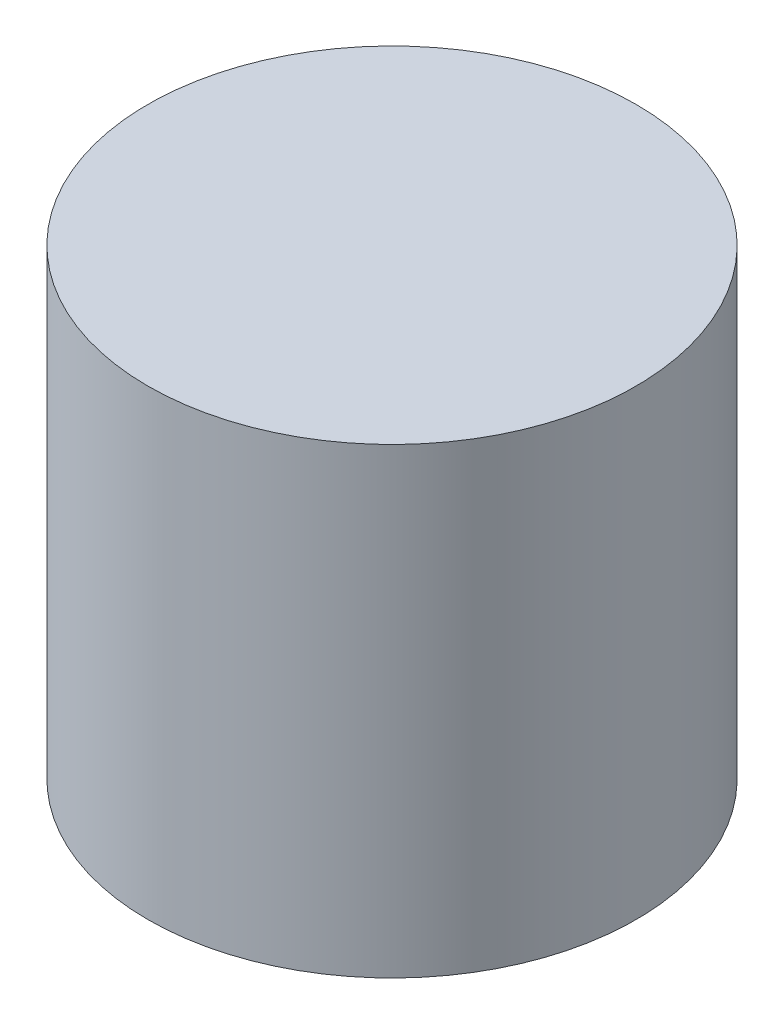
ISO-10303-21;
HEADER;
FILE_DESCRIPTION(('STEP AP214'),'2;1');
FILE_NAME('part.step','',(''),(''),'','','');
FILE_SCHEMA(('AUTOMOTIVE_DESIGN { 1 0 10303 214 1 1 1 1 }'));
ENDSEC;
DATA;
#1=APPLICATION_CONTEXT('core data for automotive mechanical design processes');
#2=APPLICATION_PROTOCOL_DEFINITION('international standard','automotive_design',2000,#1);
#3=PRODUCT_CONTEXT('',#1,'mechanical');
#4=PRODUCT('Part','Part','',(#3));
#5=PRODUCT_RELATED_PRODUCT_CATEGORY('part','',(#4));
#6=PRODUCT_DEFINITION_FORMATION('','',#4);
#7=PRODUCT_DEFINITION_CONTEXT('part definition',#1,'design');
#8=PRODUCT_DEFINITION('design','',#6,#7);
#9=PRODUCT_DEFINITION_SHAPE('','',#8);
#10=(LENGTH_UNIT() NAMED_UNIT(*) SI_UNIT(.MILLI.,.METRE.));
#11=(NAMED_UNIT(*) PLANE_ANGLE_UNIT() SI_UNIT($,.RADIAN.));
#12=(NAMED_UNIT(*) SI_UNIT($,.STERADIAN.) SOLID_ANGLE_UNIT());
#13=UNCERTAINTY_MEASURE_WITH_UNIT(LENGTH_MEASURE(1.E-05),#10,'distance_accuracy_value','');
#14=(GEOMETRIC_REPRESENTATION_CONTEXT(3) GLOBAL_UNCERTAINTY_ASSIGNED_CONTEXT((#13)) GLOBAL_UNIT_ASSIGNED_CONTEXT((#10,
#11,#12)) REPRESENTATION_CONTEXT('',''));
#15=CARTESIAN_POINT('',(0.,0.,0.));
#16=DIRECTION('',(0.,0.,1.));
#17=DIRECTION('',(1.,0.,0.));
#18=AXIS2_PLACEMENT_3D('',#15,#16,#17);
#19=CARTESIAN_POINT('',(0.,71.,0.));
#20=DIRECTION('',(0.,-1.,0.));
#21=DIRECTION('',(0.,0.,-1.));
#22=AXIS2_PLACEMENT_3D('',#19,#20,#21);
#23=CYLINDRICAL_SURFACE('',#22,37.5);
#24=CARTESIAN_POINT('',(0.,71.,0.));
#25=DIRECTION('',(0.,1.,0.));
#26=DIRECTION('',(0.,0.,1.));
#27=AXIS2_PLACEMENT_3D('',#24,#25,#26);
#28=CIRCLE('',#27,37.5);
#29=CARTESIAN_POINT('',(0.,71.,37.5));
#30=VERTEX_POINT('',#29);
#31=EDGE_CURVE('E10',#30,#30,#28,.T.);
#32=ORIENTED_EDGE('',*,*,#31,.F.);
#33=EDGE_LOOP('',(#32));
#34=FACE_BOUND('',#33,.T.);
#35=CARTESIAN_POINT('',(0.,0.,0.));
#36=DIRECTION('',(0.,1.,0.));
#37=DIRECTION('',(0.,0.,1.));
#38=AXIS2_PLACEMENT_3D('',#35,#36,#37);
#39=CIRCLE('',#38,37.5);
#40=CARTESIAN_POINT('',(0.,0.,37.5));
#41=VERTEX_POINT('',#40);
#42=EDGE_CURVE('E38',#41,#41,#39,.T.);
#43=ORIENTED_EDGE('',*,*,#42,.T.);
#44=EDGE_LOOP('',(#43));
#45=FACE_BOUND('',#44,.T.);
#46=ADVANCED_FACE('F35',(#34,#45),#23,.T.);
#47=CARTESIAN_POINT('',(0.,71.,0.));
#48=DIRECTION('',(0.,1.,0.));
#49=DIRECTION('',(0.,0.,1.));
#50=AXIS2_PLACEMENT_3D('',#47,#48,#49);
#51=PLANE('',#50);
#52=ORIENTED_EDGE('',*,*,#31,.T.);
#53=EDGE_LOOP('',(#52));
#54=FACE_BOUND('',#53,.T.);
#55=ADVANCED_FACE('F50',(#54),#51,.T.);
#56=CARTESIAN_POINT('',(0.,0.,0.));
#57=DIRECTION('',(0.,1.,0.));
#58=DIRECTION('',(0.,0.,1.));
#59=AXIS2_PLACEMENT_3D('',#56,#57,#58);
#60=PLANE('',#59);
#61=ORIENTED_EDGE('',*,*,#42,.F.);
#62=EDGE_LOOP('',(#61));
#63=FACE_BOUND('',#62,.T.);
#64=ADVANCED_FACE('F48',(#63),#60,.F.);
#65=CLOSED_SHELL('',(#46,#55,#64));
#66=MANIFOLD_SOLID_BREP('B2',#65);
#67=ADVANCED_BREP_SHAPE_REPRESENTATION('',(#18,#66),#14);
#68=SHAPE_DEFINITION_REPRESENTATION(#9,#67);
ENDSEC;
END-ISO-10303-21;
